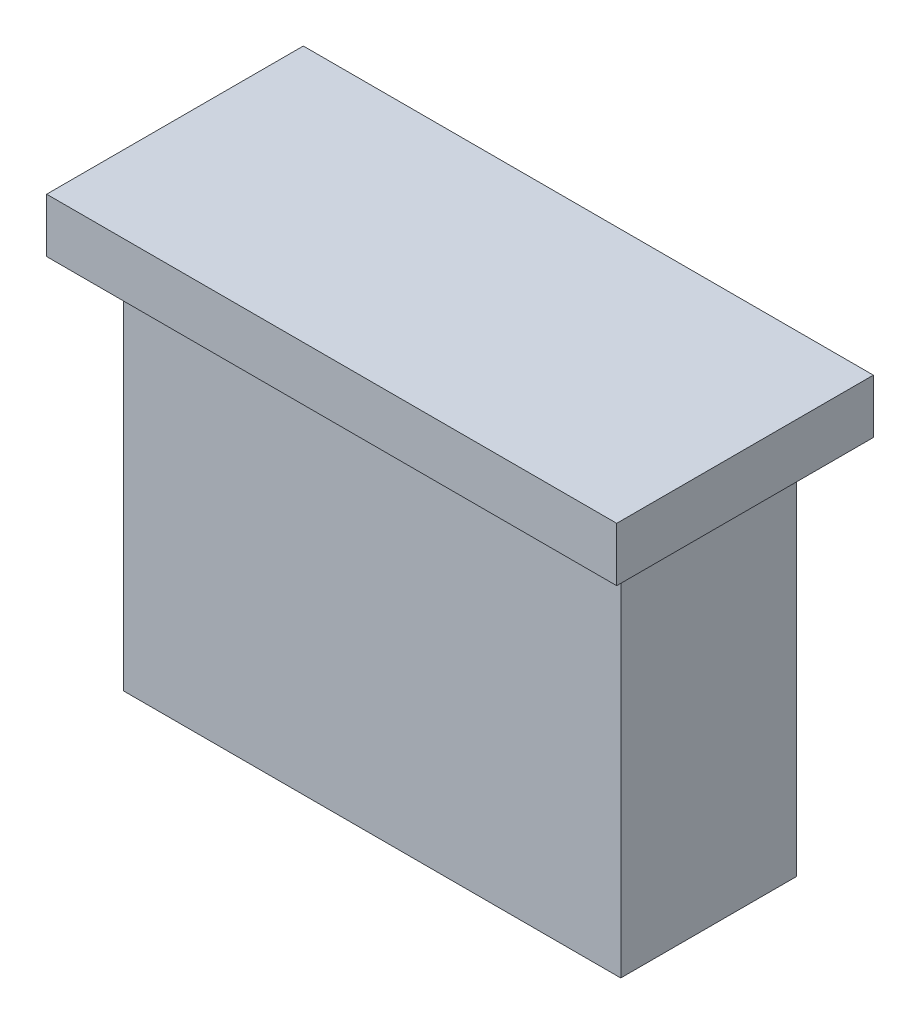
ISO-10303-21;
HEADER;
FILE_DESCRIPTION(('STEP AP214'),'2;1');
FILE_NAME('part.step','',(''),(''),'','','');
FILE_SCHEMA(('AUTOMOTIVE_DESIGN { 1 0 10303 214 1 1 1 1 }'));
ENDSEC;
DATA;
#1=APPLICATION_CONTEXT('core data for automotive mechanical design processes');
#2=APPLICATION_PROTOCOL_DEFINITION('international standard','automotive_design',2000,#1);
#3=PRODUCT_CONTEXT('',#1,'mechanical');
#4=PRODUCT('Part','Part','',(#3));
#5=PRODUCT_RELATED_PRODUCT_CATEGORY('part','',(#4));
#6=PRODUCT_DEFINITION_FORMATION('','',#4);
#7=PRODUCT_DEFINITION_CONTEXT('part definition',#1,'design');
#8=PRODUCT_DEFINITION('design','',#6,#7);
#9=PRODUCT_DEFINITION_SHAPE('','',#8);
#10=(LENGTH_UNIT() NAMED_UNIT(*) SI_UNIT(.MILLI.,.METRE.));
#11=(NAMED_UNIT(*) PLANE_ANGLE_UNIT() SI_UNIT($,.RADIAN.));
#12=(NAMED_UNIT(*) SI_UNIT($,.STERADIAN.) SOLID_ANGLE_UNIT());
#13=UNCERTAINTY_MEASURE_WITH_UNIT(LENGTH_MEASURE(1.E-05),#10,'distance_accuracy_value','');
#14=(GEOMETRIC_REPRESENTATION_CONTEXT(3) GLOBAL_UNCERTAINTY_ASSIGNED_CONTEXT((#13)) GLOBAL_UNIT_ASSIGNED_CONTEXT((#10,
#11,#12)) REPRESENTATION_CONTEXT('',''));
#15=CARTESIAN_POINT('',(0.,0.,0.));
#16=DIRECTION('',(0.,0.,1.));
#17=DIRECTION('',(1.,0.,0.));
#18=AXIS2_PLACEMENT_3D('',#15,#16,#17);
#19=CARTESIAN_POINT('',(9.2,14.,3.25));
#20=DIRECTION('',(-1.,0.,0.));
#21=DIRECTION('',(0.,0.,1.));
#22=AXIS2_PLACEMENT_3D('',#19,#20,#21);
#23=PLANE('',#22);
#24=DIRECTION('',(0.,0.,-1.));
#25=VECTOR('',#24,1.);
#26=CARTESIAN_POINT('',(9.2,0.,3.25));
#27=LINE('',#26,#25);
#28=CARTESIAN_POINT('',(9.2,0.,3.25));
#29=VERTEX_POINT('',#28);
#30=CARTESIAN_POINT('',(9.2,0.,-3.25));
#31=VERTEX_POINT('',#30);
#32=EDGE_CURVE('E132',#29,#31,#27,.T.);
#33=ORIENTED_EDGE('',*,*,#32,.T.);
#34=DIRECTION('',(0.,-1.,0.));
#35=VECTOR('',#34,1.);
#36=CARTESIAN_POINT('',(9.2,14.,-3.25));
#37=LINE('',#36,#35);
#38=CARTESIAN_POINT('',(9.2,14.,-3.25));
#39=VERTEX_POINT('',#38);
#40=EDGE_CURVE('E11',#39,#31,#37,.T.);
#41=ORIENTED_EDGE('',*,*,#40,.F.);
#42=DIRECTION('',(0.,0.,-1.));
#43=VECTOR('',#42,1.);
#44=CARTESIAN_POINT('',(9.2,14.,3.25));
#45=LINE('',#44,#43);
#46=CARTESIAN_POINT('',(9.2,14.,3.25));
#47=VERTEX_POINT('',#46);
#48=EDGE_CURVE('E141',#47,#39,#45,.T.);
#49=ORIENTED_EDGE('',*,*,#48,.F.);
#50=DIRECTION('',(0.,-1.,0.));
#51=VECTOR('',#50,1.);
#52=CARTESIAN_POINT('',(9.2,14.,3.25));
#53=LINE('',#52,#51);
#54=EDGE_CURVE('E150',#47,#29,#53,.T.);
#55=ORIENTED_EDGE('',*,*,#54,.T.);
#56=EDGE_LOOP('',(#33,#41,#49,#55));
#57=FACE_BOUND('',#56,.T.);
#58=ADVANCED_FACE('F34',(#57),#23,.F.);
#59=CARTESIAN_POINT('',(-9.2,14.,-3.25));
#60=DIRECTION('',(0.,0.,1.));
#61=DIRECTION('',(1.,0.,0.));
#62=AXIS2_PLACEMENT_3D('',#59,#60,#61);
#63=PLANE('',#62);
#64=DIRECTION('',(-1.,0.,0.));
#65=VECTOR('',#64,1.);
#66=CARTESIAN_POINT('',(-9.2,0.,-3.25));
#67=LINE('',#66,#65);
#68=CARTESIAN_POINT('',(-9.2,0.,-3.25));
#69=VERTEX_POINT('',#68);
#70=EDGE_CURVE('E135',#31,#69,#67,.T.);
#71=ORIENTED_EDGE('',*,*,#70,.T.);
#72=DIRECTION('',(0.,-1.,0.));
#73=VECTOR('',#72,1.);
#74=CARTESIAN_POINT('',(-9.2,14.,-3.25));
#75=LINE('',#74,#73);
#76=CARTESIAN_POINT('',(-9.2,14.,-3.25));
#77=VERTEX_POINT('',#76);
#78=EDGE_CURVE('E42',#77,#69,#75,.T.);
#79=ORIENTED_EDGE('',*,*,#78,.F.);
#80=DIRECTION('',(-1.,0.,0.));
#81=VECTOR('',#80,1.);
#82=CARTESIAN_POINT('',(-9.2,14.,-3.25));
#83=LINE('',#82,#81);
#84=EDGE_CURVE('E76',#39,#77,#83,.T.);
#85=ORIENTED_EDGE('',*,*,#84,.F.);
#86=ORIENTED_EDGE('',*,*,#40,.T.);
#87=EDGE_LOOP('',(#71,#79,#85,#86));
#88=FACE_BOUND('',#87,.T.);
#89=ADVANCED_FACE('F176',(#88),#63,.F.);
#90=CARTESIAN_POINT('',(-9.2,14.,3.25));
#91=DIRECTION('',(1.,0.,0.));
#92=DIRECTION('',(0.,0.,-1.));
#93=AXIS2_PLACEMENT_3D('',#90,#91,#92);
#94=PLANE('',#93);
#95=DIRECTION('',(0.,0.,1.));
#96=VECTOR('',#95,1.);
#97=CARTESIAN_POINT('',(-9.2,0.,3.25));
#98=LINE('',#97,#96);
#99=CARTESIAN_POINT('',(-9.2,0.,3.25));
#100=VERTEX_POINT('',#99);
#101=EDGE_CURVE('E66',#69,#100,#98,.T.);
#102=ORIENTED_EDGE('',*,*,#101,.T.);
#103=DIRECTION('',(0.,-1.,0.));
#104=VECTOR('',#103,1.);
#105=CARTESIAN_POINT('',(-9.2,14.,3.25));
#106=LINE('',#105,#104);
#107=CARTESIAN_POINT('',(-9.2,14.,3.25));
#108=VERTEX_POINT('',#107);
#109=EDGE_CURVE('E50',#108,#100,#106,.T.);
#110=ORIENTED_EDGE('',*,*,#109,.F.);
#111=DIRECTION('',(0.,0.,1.));
#112=VECTOR('',#111,1.);
#113=CARTESIAN_POINT('',(-9.2,14.,3.25));
#114=LINE('',#113,#112);
#115=EDGE_CURVE('E145',#77,#108,#114,.T.);
#116=ORIENTED_EDGE('',*,*,#115,.F.);
#117=ORIENTED_EDGE('',*,*,#78,.T.);
#118=EDGE_LOOP('',(#102,#110,#116,#117));
#119=FACE_BOUND('',#118,.T.);
#120=ADVANCED_FACE('F156',(#119),#94,.F.);
#121=CARTESIAN_POINT('',(-9.2,14.,3.25));
#122=DIRECTION('',(0.,0.,-1.));
#123=DIRECTION('',(-1.,0.,0.));
#124=AXIS2_PLACEMENT_3D('',#121,#122,#123);
#125=PLANE('',#124);
#126=DIRECTION('',(1.,0.,0.));
#127=VECTOR('',#126,1.);
#128=CARTESIAN_POINT('',(-9.2,0.,3.25));
#129=LINE('',#128,#127);
#130=EDGE_CURVE('E71',#100,#29,#129,.T.);
#131=ORIENTED_EDGE('',*,*,#130,.T.);
#132=ORIENTED_EDGE('',*,*,#54,.F.);
#133=DIRECTION('',(1.,0.,0.));
#134=VECTOR('',#133,1.);
#135=CARTESIAN_POINT('',(-9.2,14.,3.25));
#136=LINE('',#135,#134);
#137=EDGE_CURVE('E148',#108,#47,#136,.T.);
#138=ORIENTED_EDGE('',*,*,#137,.F.);
#139=ORIENTED_EDGE('',*,*,#109,.T.);
#140=EDGE_LOOP('',(#131,#132,#138,#139));
#141=FACE_BOUND('',#140,.T.);
#142=ADVANCED_FACE('F161',(#141),#125,.F.);
#143=CARTESIAN_POINT('',(0.,0.,0.));
#144=DIRECTION('',(0.,-1.,0.));
#145=DIRECTION('',(0.,0.,-1.));
#146=AXIS2_PLACEMENT_3D('',#143,#144,#145);
#147=PLANE('',#146);
#148=ORIENTED_EDGE('',*,*,#32,.F.);
#149=ORIENTED_EDGE('',*,*,#130,.F.);
#150=ORIENTED_EDGE('',*,*,#101,.F.);
#151=ORIENTED_EDGE('',*,*,#70,.F.);
#152=EDGE_LOOP('',(#148,#149,#150,#151));
#153=FACE_BOUND('',#152,.T.);
#154=ADVANCED_FACE('F159',(#153),#147,.T.);
#155=CARTESIAN_POINT('',(0.,14.,0.));
#156=DIRECTION('',(0.,-1.,0.));
#157=DIRECTION('',(0.,0.,-1.));
#158=AXIS2_PLACEMENT_3D('',#155,#156,#157);
#159=PLANE('',#158);
#160=DIRECTION('',(0.,0.,-1.));
#161=VECTOR('',#160,1.);
#162=CARTESIAN_POINT('',(10.55,14.,4.75));
#163=LINE('',#162,#161);
#164=CARTESIAN_POINT('',(10.55,14.,4.75));
#165=VERTEX_POINT('',#164);
#166=CARTESIAN_POINT('',(10.55,14.,-4.75));
#167=VERTEX_POINT('',#166);
#168=EDGE_CURVE('E131',#165,#167,#163,.T.);
#169=ORIENTED_EDGE('',*,*,#168,.F.);
#170=DIRECTION('',(1.,0.,0.));
#171=VECTOR('',#170,1.);
#172=CARTESIAN_POINT('',(-10.55,14.,4.75));
#173=LINE('',#172,#171);
#174=CARTESIAN_POINT('',(-10.55,14.,4.75));
#175=VERTEX_POINT('',#174);
#176=EDGE_CURVE('E127',#175,#165,#173,.T.);
#177=ORIENTED_EDGE('',*,*,#176,.F.);
#178=DIRECTION('',(0.,0.,1.));
#179=VECTOR('',#178,1.);
#180=CARTESIAN_POINT('',(-10.55,14.,4.75));
#181=LINE('',#180,#179);
#182=CARTESIAN_POINT('',(-10.55,14.,-4.75));
#183=VERTEX_POINT('',#182);
#184=EDGE_CURVE('E203',#183,#175,#181,.T.);
#185=ORIENTED_EDGE('',*,*,#184,.F.);
#186=DIRECTION('',(-1.,0.,0.));
#187=VECTOR('',#186,1.);
#188=CARTESIAN_POINT('',(-10.55,14.,-4.75));
#189=LINE('',#188,#187);
#190=EDGE_CURVE('E206',#167,#183,#189,.T.);
#191=ORIENTED_EDGE('',*,*,#190,.F.);
#192=EDGE_LOOP('',(#169,#177,#185,#191));
#193=FACE_BOUND('',#192,.T.);
#194=ORIENTED_EDGE('',*,*,#48,.T.);
#195=ORIENTED_EDGE('',*,*,#84,.T.);
#196=ORIENTED_EDGE('',*,*,#115,.T.);
#197=ORIENTED_EDGE('',*,*,#137,.T.);
#198=EDGE_LOOP('',(#194,#195,#196,#197));
#199=FACE_BOUND('',#198,.T.);
#200=ADVANCED_FACE('F163',(#193,#199),#159,.T.);
#201=CARTESIAN_POINT('',(10.55,16.,4.75));
#202=DIRECTION('',(-1.,0.,0.));
#203=DIRECTION('',(0.,0.,1.));
#204=AXIS2_PLACEMENT_3D('',#201,#202,#203);
#205=PLANE('',#204);
#206=ORIENTED_EDGE('',*,*,#168,.T.);
#207=DIRECTION('',(0.,-1.,0.));
#208=VECTOR('',#207,1.);
#209=CARTESIAN_POINT('',(10.55,16.,-4.75));
#210=LINE('',#209,#208);
#211=CARTESIAN_POINT('',(10.55,16.,-4.75));
#212=VERTEX_POINT('',#211);
#213=EDGE_CURVE('E111',#212,#167,#210,.T.);
#214=ORIENTED_EDGE('',*,*,#213,.F.);
#215=DIRECTION('',(0.,0.,-1.));
#216=VECTOR('',#215,1.);
#217=CARTESIAN_POINT('',(10.55,16.,4.75));
#218=LINE('',#217,#216);
#219=CARTESIAN_POINT('',(10.55,16.,4.75));
#220=VERTEX_POINT('',#219);
#221=EDGE_CURVE('E118',#220,#212,#218,.T.);
#222=ORIENTED_EDGE('',*,*,#221,.F.);
#223=DIRECTION('',(0.,-1.,0.));
#224=VECTOR('',#223,1.);
#225=CARTESIAN_POINT('',(10.55,16.,4.75));
#226=LINE('',#225,#224);
#227=EDGE_CURVE('E200',#220,#165,#226,.T.);
#228=ORIENTED_EDGE('',*,*,#227,.T.);
#229=EDGE_LOOP('',(#206,#214,#222,#228));
#230=FACE_BOUND('',#229,.T.);
#231=ADVANCED_FACE('F129',(#230),#205,.F.);
#232=CARTESIAN_POINT('',(-10.55,16.,-4.75));
#233=DIRECTION('',(0.,0.,1.));
#234=DIRECTION('',(1.,0.,0.));
#235=AXIS2_PLACEMENT_3D('',#232,#233,#234);
#236=PLANE('',#235);
#237=ORIENTED_EDGE('',*,*,#190,.T.);
#238=DIRECTION('',(0.,-1.,0.));
#239=VECTOR('',#238,1.);
#240=CARTESIAN_POINT('',(-10.55,16.,-4.75));
#241=LINE('',#240,#239);
#242=CARTESIAN_POINT('',(-10.55,16.,-4.75));
#243=VERTEX_POINT('',#242);
#244=EDGE_CURVE('E114',#243,#183,#241,.T.);
#245=ORIENTED_EDGE('',*,*,#244,.F.);
#246=DIRECTION('',(-1.,0.,0.));
#247=VECTOR('',#246,1.);
#248=CARTESIAN_POINT('',(-10.55,16.,-4.75));
#249=LINE('',#248,#247);
#250=EDGE_CURVE('E107',#212,#243,#249,.T.);
#251=ORIENTED_EDGE('',*,*,#250,.F.);
#252=ORIENTED_EDGE('',*,*,#213,.T.);
#253=EDGE_LOOP('',(#237,#245,#251,#252));
#254=FACE_BOUND('',#253,.T.);
#255=ADVANCED_FACE('F109',(#254),#236,.F.);
#256=CARTESIAN_POINT('',(-10.55,16.,4.75));
#257=DIRECTION('',(1.,0.,0.));
#258=DIRECTION('',(0.,0.,-1.));
#259=AXIS2_PLACEMENT_3D('',#256,#257,#258);
#260=PLANE('',#259);
#261=ORIENTED_EDGE('',*,*,#184,.T.);
#262=DIRECTION('',(0.,-1.,0.));
#263=VECTOR('',#262,1.);
#264=CARTESIAN_POINT('',(-10.55,16.,4.75));
#265=LINE('',#264,#263);
#266=CARTESIAN_POINT('',(-10.55,16.,4.75));
#267=VERTEX_POINT('',#266);
#268=EDGE_CURVE('E137',#267,#175,#265,.T.);
#269=ORIENTED_EDGE('',*,*,#268,.F.);
#270=DIRECTION('',(0.,0.,1.));
#271=VECTOR('',#270,1.);
#272=CARTESIAN_POINT('',(-10.55,16.,4.75));
#273=LINE('',#272,#271);
#274=EDGE_CURVE('E117',#243,#267,#273,.T.);
#275=ORIENTED_EDGE('',*,*,#274,.F.);
#276=ORIENTED_EDGE('',*,*,#244,.T.);
#277=EDGE_LOOP('',(#261,#269,#275,#276));
#278=FACE_BOUND('',#277,.T.);
#279=ADVANCED_FACE('F189',(#278),#260,.F.);
#280=CARTESIAN_POINT('',(-10.55,16.,4.75));
#281=DIRECTION('',(0.,0.,-1.));
#282=DIRECTION('',(-1.,0.,0.));
#283=AXIS2_PLACEMENT_3D('',#280,#281,#282);
#284=PLANE('',#283);
#285=ORIENTED_EDGE('',*,*,#176,.T.);
#286=ORIENTED_EDGE('',*,*,#227,.F.);
#287=DIRECTION('',(1.,0.,0.));
#288=VECTOR('',#287,1.);
#289=CARTESIAN_POINT('',(-10.55,16.,4.75));
#290=LINE('',#289,#288);
#291=EDGE_CURVE('E123',#267,#220,#290,.T.);
#292=ORIENTED_EDGE('',*,*,#291,.F.);
#293=ORIENTED_EDGE('',*,*,#268,.T.);
#294=EDGE_LOOP('',(#285,#286,#292,#293));
#295=FACE_BOUND('',#294,.T.);
#296=ADVANCED_FACE('F191',(#295),#284,.F.);
#297=CARTESIAN_POINT('',(0.,16.,0.));
#298=DIRECTION('',(0.,-1.,0.));
#299=DIRECTION('',(0.,0.,-1.));
#300=AXIS2_PLACEMENT_3D('',#297,#298,#299);
#301=PLANE('',#300);
#302=ORIENTED_EDGE('',*,*,#221,.T.);
#303=ORIENTED_EDGE('',*,*,#250,.T.);
#304=ORIENTED_EDGE('',*,*,#274,.T.);
#305=ORIENTED_EDGE('',*,*,#291,.T.);
#306=EDGE_LOOP('',(#302,#303,#304,#305));
#307=FACE_BOUND('',#306,.T.);
#308=ADVANCED_FACE('F121',(#307),#301,.F.);
#309=CLOSED_SHELL('',(#58,#89,#120,#142,#154,#200,#231,#255,#279,#296,#308));
#310=MANIFOLD_SOLID_BREP('B2',#309);
#311=ADVANCED_BREP_SHAPE_REPRESENTATION('',(#18,#310),#14);
#312=SHAPE_DEFINITION_REPRESENTATION(#9,#311);
ENDSEC;
END-ISO-10303-21;
